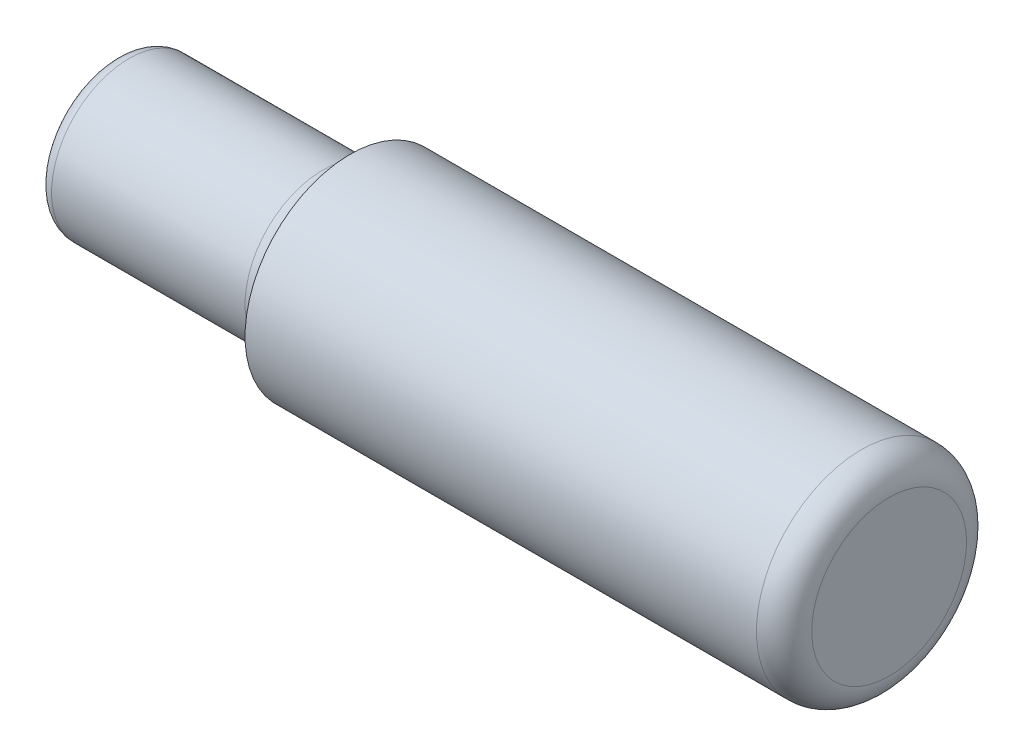
ISO-10303-21;
HEADER;
FILE_DESCRIPTION(('STEP AP214'),'2;1');
FILE_NAME('part.step','',(''),(''),'','','');
FILE_SCHEMA(('AUTOMOTIVE_DESIGN { 1 0 10303 214 1 1 1 1 }'));
ENDSEC;
DATA;
#1=APPLICATION_CONTEXT('core data for automotive mechanical design processes');
#2=APPLICATION_PROTOCOL_DEFINITION('international standard','automotive_design',2000,#1);
#3=PRODUCT_CONTEXT('',#1,'mechanical');
#4=PRODUCT('Part','Part','',(#3));
#5=PRODUCT_RELATED_PRODUCT_CATEGORY('part','',(#4));
#6=PRODUCT_DEFINITION_FORMATION('','',#4);
#7=PRODUCT_DEFINITION_CONTEXT('part definition',#1,'design');
#8=PRODUCT_DEFINITION('design','',#6,#7);
#9=PRODUCT_DEFINITION_SHAPE('','',#8);
#10=(LENGTH_UNIT() NAMED_UNIT(*) SI_UNIT(.MILLI.,.METRE.));
#11=(NAMED_UNIT(*) PLANE_ANGLE_UNIT() SI_UNIT($,.RADIAN.));
#12=(NAMED_UNIT(*) SI_UNIT($,.STERADIAN.) SOLID_ANGLE_UNIT());
#13=UNCERTAINTY_MEASURE_WITH_UNIT(LENGTH_MEASURE(1.E-05),#10,'distance_accuracy_value','');
#14=(GEOMETRIC_REPRESENTATION_CONTEXT(3) GLOBAL_UNCERTAINTY_ASSIGNED_CONTEXT((#13)) GLOBAL_UNIT_ASSIGNED_CONTEXT((#10,
#11,#12)) REPRESENTATION_CONTEXT('',''));
#15=CARTESIAN_POINT('',(0.,0.,0.));
#16=DIRECTION('',(0.,0.,1.));
#17=DIRECTION('',(1.,0.,0.));
#18=AXIS2_PLACEMENT_3D('',#15,#16,#17);
#19=CARTESIAN_POINT('',(19.5,0.,0.));
#20=DIRECTION('',(-1.,0.,0.));
#21=DIRECTION('',(0.,0.,1.));
#22=AXIS2_PLACEMENT_3D('',#19,#20,#21);
#23=CYLINDRICAL_SURFACE('',#22,3.8);
#24=CARTESIAN_POINT('',(18.5,0.,0.));
#25=DIRECTION('',(1.,0.,0.));
#26=DIRECTION('',(0.,0.,-1.));
#27=AXIS2_PLACEMENT_3D('',#24,#25,#26);
#28=CIRCLE('',#27,3.8);
#29=CARTESIAN_POINT('',(18.5,0.,-3.8));
#30=VERTEX_POINT('',#29);
#31=EDGE_CURVE('E61',#30,#30,#28,.F.);
#32=ORIENTED_EDGE('',*,*,#31,.T.);
#33=EDGE_LOOP('',(#32));
#34=FACE_BOUND('',#33,.T.);
#35=CARTESIAN_POINT('',(0.,0.,0.));
#36=DIRECTION('',(1.,0.,0.));
#37=DIRECTION('',(0.,0.,-1.));
#38=AXIS2_PLACEMENT_3D('',#35,#36,#37);
#39=CIRCLE('',#38,3.8);
#40=CARTESIAN_POINT('',(0.,0.,-3.8));
#41=VERTEX_POINT('',#40);
#42=EDGE_CURVE('E71',#41,#41,#39,.T.);
#43=ORIENTED_EDGE('',*,*,#42,.T.);
#44=EDGE_LOOP('',(#43));
#45=FACE_BOUND('',#44,.T.);
#46=ADVANCED_FACE('F43',(#34,#45),#23,.T.);
#47=CARTESIAN_POINT('',(19.5,0.,0.));
#48=DIRECTION('',(1.,0.,0.));
#49=DIRECTION('',(0.,0.,-1.));
#50=AXIS2_PLACEMENT_3D('',#47,#48,#49);
#51=PLANE('',#50);
#52=CARTESIAN_POINT('',(19.5,0.,0.));
#53=DIRECTION('',(1.,0.,0.));
#54=DIRECTION('',(0.,0.,-1.));
#55=AXIS2_PLACEMENT_3D('',#52,#53,#54);
#56=CIRCLE('',#55,2.8);
#57=CARTESIAN_POINT('',(19.5,0.,-2.8));
#58=VERTEX_POINT('',#57);
#59=EDGE_CURVE('E67',#58,#58,#56,.T.);
#60=ORIENTED_EDGE('',*,*,#59,.T.);
#61=EDGE_LOOP('',(#60));
#62=FACE_BOUND('',#61,.T.);
#63=ADVANCED_FACE('F92',(#62),#51,.T.);
#64=CARTESIAN_POINT('',(-8.5,0.,0.));
#65=DIRECTION('',(1.,0.,0.));
#66=DIRECTION('',(0.,0.,-1.));
#67=AXIS2_PLACEMENT_3D('',#64,#65,#66);
#68=CYLINDRICAL_SURFACE('',#67,2.8);
#69=CARTESIAN_POINT('',(-8.,0.,0.));
#70=DIRECTION('',(1.,0.,0.));
#71=DIRECTION('',(0.,0.,-1.));
#72=AXIS2_PLACEMENT_3D('',#69,#70,#71);
#73=CIRCLE('',#72,2.8);
#74=CARTESIAN_POINT('',(-8.,0.,-2.8));
#75=VERTEX_POINT('',#74);
#76=EDGE_CURVE('E51',#75,#75,#73,.T.);
#77=ORIENTED_EDGE('',*,*,#76,.T.);
#78=EDGE_LOOP('',(#77));
#79=FACE_BOUND('',#78,.T.);
#80=CARTESIAN_POINT('',(-1.,0.,0.));
#81=DIRECTION('',(1.,0.,0.));
#82=DIRECTION('',(0.,0.,-1.));
#83=AXIS2_PLACEMENT_3D('',#80,#81,#82);
#84=CIRCLE('',#83,2.8);
#85=CARTESIAN_POINT('',(-1.,0.,-2.8));
#86=VERTEX_POINT('',#85);
#87=EDGE_CURVE('E56',#86,#86,#84,.F.);
#88=ORIENTED_EDGE('',*,*,#87,.T.);
#89=EDGE_LOOP('',(#88));
#90=FACE_BOUND('',#89,.T.);
#91=ADVANCED_FACE('F98',(#79,#90),#68,.T.);
#92=CARTESIAN_POINT('',(-8.5,0.,0.));
#93=DIRECTION('',(1.,0.,0.));
#94=DIRECTION('',(0.,0.,-1.));
#95=AXIS2_PLACEMENT_3D('',#92,#93,#94);
#96=PLANE('',#95);
#97=CARTESIAN_POINT('',(-8.5,0.,0.));
#98=DIRECTION('',(1.,0.,0.));
#99=DIRECTION('',(0.,0.,-1.));
#100=AXIS2_PLACEMENT_3D('',#97,#98,#99);
#101=CIRCLE('',#100,2.3);
#102=CARTESIAN_POINT('',(-8.5,0.,-2.3));
#103=VERTEX_POINT('',#102);
#104=EDGE_CURVE('E10',#103,#103,#101,.F.);
#105=ORIENTED_EDGE('',*,*,#104,.T.);
#106=EDGE_LOOP('',(#105));
#107=FACE_BOUND('',#106,.T.);
#108=ADVANCED_FACE('F87',(#107),#96,.F.);
#109=CARTESIAN_POINT('',(18.5,0.,0.));
#110=DIRECTION('',(1.,0.,0.));
#111=DIRECTION('',(0.,0.,-1.));
#112=AXIS2_PLACEMENT_3D('',#109,#110,#111);
#113=TOROIDAL_SURFACE('',#112,2.8,1.);
#114=ORIENTED_EDGE('',*,*,#31,.F.);
#115=EDGE_LOOP('',(#114));
#116=FACE_BOUND('',#115,.T.);
#117=ORIENTED_EDGE('',*,*,#59,.F.);
#118=EDGE_LOOP('',(#117));
#119=FACE_BOUND('',#118,.T.);
#120=ADVANCED_FACE('F79',(#116,#119),#113,.T.);
#121=CARTESIAN_POINT('',(-1.,0.,0.));
#122=DIRECTION('',(1.,0.,0.));
#123=DIRECTION('',(0.,0.,-1.));
#124=AXIS2_PLACEMENT_3D('',#121,#122,#123);
#125=TOROIDAL_SURFACE('',#124,3.8,1.);
#126=ORIENTED_EDGE('',*,*,#87,.F.);
#127=EDGE_LOOP('',(#126));
#128=FACE_BOUND('',#127,.T.);
#129=ORIENTED_EDGE('',*,*,#42,.F.);
#130=EDGE_LOOP('',(#129));
#131=FACE_BOUND('',#130,.T.);
#132=ADVANCED_FACE('F77',(#128,#131),#125,.F.);
#133=CARTESIAN_POINT('',(-8.,0.,0.));
#134=DIRECTION('',(1.,0.,0.));
#135=DIRECTION('',(0.,0.,-1.));
#136=AXIS2_PLACEMENT_3D('',#133,#134,#135);
#137=TOROIDAL_SURFACE('',#136,2.3,0.5);
#138=ORIENTED_EDGE('',*,*,#104,.F.);
#139=EDGE_LOOP('',(#138));
#140=FACE_BOUND('',#139,.T.);
#141=ORIENTED_EDGE('',*,*,#76,.F.);
#142=EDGE_LOOP('',(#141));
#143=FACE_BOUND('',#142,.T.);
#144=ADVANCED_FACE('F45',(#140,#143),#137,.T.);
#145=CLOSED_SHELL('',(#46,#63,#91,#108,#120,#132,#144));
#146=MANIFOLD_SOLID_BREP('B2',#145);
#147=ADVANCED_BREP_SHAPE_REPRESENTATION('',(#18,#146),#14);
#148=SHAPE_DEFINITION_REPRESENTATION(#9,#147);
ENDSEC;
END-ISO-10303-21;
